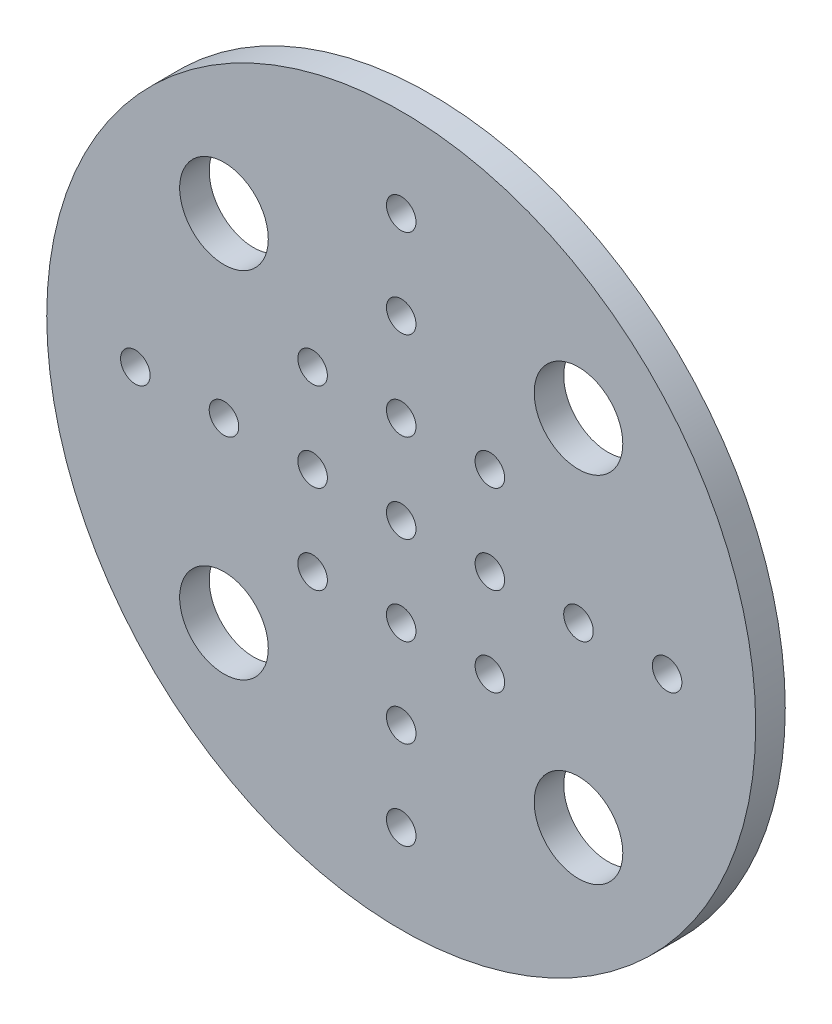
ISO-10303-21;
HEADER;
FILE_DESCRIPTION(('STEP AP214'),'2;1');
FILE_NAME('part.step','',(''),(''),'','','');
FILE_SCHEMA(('AUTOMOTIVE_DESIGN { 1 0 10303 214 1 1 1 1 }'));
ENDSEC;
DATA;
#1=APPLICATION_CONTEXT('core data for automotive mechanical design processes');
#2=APPLICATION_PROTOCOL_DEFINITION('international standard','automotive_design',2000,#1);
#3=PRODUCT_CONTEXT('',#1,'mechanical');
#4=PRODUCT('Part','Part','',(#3));
#5=PRODUCT_RELATED_PRODUCT_CATEGORY('part','',(#4));
#6=PRODUCT_DEFINITION_FORMATION('','',#4);
#7=PRODUCT_DEFINITION_CONTEXT('part definition',#1,'design');
#8=PRODUCT_DEFINITION('design','',#6,#7);
#9=PRODUCT_DEFINITION_SHAPE('','',#8);
#10=(LENGTH_UNIT() NAMED_UNIT(*) SI_UNIT(.MILLI.,.METRE.));
#11=(NAMED_UNIT(*) PLANE_ANGLE_UNIT() SI_UNIT($,.RADIAN.));
#12=(NAMED_UNIT(*) SI_UNIT($,.STERADIAN.) SOLID_ANGLE_UNIT());
#13=UNCERTAINTY_MEASURE_WITH_UNIT(LENGTH_MEASURE(1.E-05),#10,'distance_accuracy_value','');
#14=(GEOMETRIC_REPRESENTATION_CONTEXT(3) GLOBAL_UNCERTAINTY_ASSIGNED_CONTEXT((#13)) GLOBAL_UNIT_ASSIGNED_CONTEXT((#10,
#11,#12)) REPRESENTATION_CONTEXT('',''));
#15=CARTESIAN_POINT('',(0.,0.,0.));
#16=DIRECTION('',(0.,0.,1.));
#17=DIRECTION('',(1.,0.,0.));
#18=AXIS2_PLACEMENT_3D('',#15,#16,#17);
#19=CARTESIAN_POINT('',(225.2594539797,284.786767066,3.));
#20=DIRECTION('',(0.,0.,1.));
#21=DIRECTION('',(1.,0.,0.));
#22=AXIS2_PLACEMENT_3D('',#19,#20,#21);
#23=PLANE('',#22);
#24=CARTESIAN_POINT('',(234.2594539797,275.786767066,3.));
#25=DIRECTION('',(0.,0.,1.));
#26=DIRECTION('',(1.,0.,0.));
#27=AXIS2_PLACEMENT_3D('',#24,#25,#26);
#28=CIRCLE('',#27,1.5);
#29=CARTESIAN_POINT('',(235.7594539797,275.786767066,3.));
#30=VERTEX_POINT('',#29);
#31=EDGE_CURVE('E155',#30,#30,#28,.T.);
#32=ORIENTED_EDGE('',*,*,#31,.F.);
#33=EDGE_LOOP('',(#32));
#34=FACE_BOUND('',#33,.T.);
#35=CARTESIAN_POINT('',(216.2594539797,275.786767066,3.));
#36=DIRECTION('',(0.,0.,1.));
#37=DIRECTION('',(1.,0.,0.));
#38=AXIS2_PLACEMENT_3D('',#35,#36,#37);
#39=CIRCLE('',#38,1.5);
#40=CARTESIAN_POINT('',(217.7594539797,275.786767066,3.));
#41=VERTEX_POINT('',#40);
#42=EDGE_CURVE('E143',#41,#41,#39,.T.);
#43=ORIENTED_EDGE('',*,*,#42,.F.);
#44=EDGE_LOOP('',(#43));
#45=FACE_BOUND('',#44,.T.);
#46=CARTESIAN_POINT('',(225.2594539797,266.786767066,3.));
#47=DIRECTION('',(0.,0.,1.));
#48=DIRECTION('',(1.,0.,0.));
#49=AXIS2_PLACEMENT_3D('',#46,#47,#48);
#50=CIRCLE('',#49,1.5);
#51=CARTESIAN_POINT('',(226.7594539797,266.786767066,3.));
#52=VERTEX_POINT('',#51);
#53=EDGE_CURVE('E131',#52,#52,#50,.T.);
#54=ORIENTED_EDGE('',*,*,#53,.F.);
#55=EDGE_LOOP('',(#54));
#56=FACE_BOUND('',#55,.T.);
#57=CARTESIAN_POINT('',(225.2594539797,302.786767066,3.));
#58=DIRECTION('',(0.,0.,1.));
#59=DIRECTION('',(1.,0.,0.));
#60=AXIS2_PLACEMENT_3D('',#57,#58,#59);
#61=CIRCLE('',#60,1.5);
#62=CARTESIAN_POINT('',(226.7594539797,302.786767066,3.));
#63=VERTEX_POINT('',#62);
#64=EDGE_CURVE('E119',#63,#63,#61,.T.);
#65=ORIENTED_EDGE('',*,*,#64,.F.);
#66=EDGE_LOOP('',(#65));
#67=FACE_BOUND('',#66,.T.);
#68=CARTESIAN_POINT('',(198.2594539797,284.786767066,3.));
#69=DIRECTION('',(0.,0.,1.));
#70=DIRECTION('',(1.,0.,0.));
#71=AXIS2_PLACEMENT_3D('',#68,#69,#70);
#72=CIRCLE('',#71,1.5);
#73=CARTESIAN_POINT('',(199.7594539797,284.786767066,3.));
#74=VERTEX_POINT('',#73);
#75=EDGE_CURVE('E107',#74,#74,#72,.T.);
#76=ORIENTED_EDGE('',*,*,#75,.F.);
#77=EDGE_LOOP('',(#76));
#78=FACE_BOUND('',#77,.T.);
#79=CARTESIAN_POINT('',(243.2594539797,284.786767066,3.));
#80=DIRECTION('',(0.,0.,1.));
#81=DIRECTION('',(1.,0.,0.));
#82=AXIS2_PLACEMENT_3D('',#79,#80,#81);
#83=CIRCLE('',#82,1.5);
#84=CARTESIAN_POINT('',(244.7594539797,284.786767066,3.));
#85=VERTEX_POINT('',#84);
#86=EDGE_CURVE('E95',#85,#85,#83,.T.);
#87=ORIENTED_EDGE('',*,*,#86,.F.);
#88=EDGE_LOOP('',(#87));
#89=FACE_BOUND('',#88,.T.);
#90=CARTESIAN_POINT('',(234.2594539797,284.786767066,3.));
#91=DIRECTION('',(0.,0.,1.));
#92=DIRECTION('',(1.,0.,0.));
#93=AXIS2_PLACEMENT_3D('',#90,#91,#92);
#94=CIRCLE('',#93,1.5);
#95=CARTESIAN_POINT('',(235.7594539797,284.786767066,3.));
#96=VERTEX_POINT('',#95);
#97=EDGE_CURVE('E83',#96,#96,#94,.T.);
#98=ORIENTED_EDGE('',*,*,#97,.F.);
#99=EDGE_LOOP('',(#98));
#100=FACE_BOUND('',#99,.T.);
#101=CARTESIAN_POINT('',(225.2594539797,275.786767066,3.));
#102=DIRECTION('',(0.,0.,1.));
#103=DIRECTION('',(1.,0.,0.));
#104=AXIS2_PLACEMENT_3D('',#101,#102,#103);
#105=CIRCLE('',#104,1.5);
#106=CARTESIAN_POINT('',(226.7594539797,275.786767066,3.));
#107=VERTEX_POINT('',#106);
#108=EDGE_CURVE('E71',#107,#107,#105,.T.);
#109=ORIENTED_EDGE('',*,*,#108,.F.);
#110=EDGE_LOOP('',(#109));
#111=FACE_BOUND('',#110,.T.);
#112=CARTESIAN_POINT('',(243.2594539797,302.786767066,3.));
#113=DIRECTION('',(0.,0.,1.));
#114=DIRECTION('',(1.,0.,0.));
#115=AXIS2_PLACEMENT_3D('',#112,#113,#114);
#116=CIRCLE('',#115,4.5);
#117=CARTESIAN_POINT('',(247.7594539797,302.786767066,3.));
#118=VERTEX_POINT('',#117);
#119=EDGE_CURVE('E59',#118,#118,#116,.T.);
#120=ORIENTED_EDGE('',*,*,#119,.F.);
#121=EDGE_LOOP('',(#120));
#122=FACE_BOUND('',#121,.T.);
#123=CARTESIAN_POINT('',(207.2594539797,266.786767066,3.));
#124=DIRECTION('',(0.,0.,1.));
#125=DIRECTION('',(1.,0.,0.));
#126=AXIS2_PLACEMENT_3D('',#123,#124,#125);
#127=CIRCLE('',#126,4.5);
#128=CARTESIAN_POINT('',(211.7594539797,266.786767066,3.));
#129=VERTEX_POINT('',#128);
#130=EDGE_CURVE('E47',#129,#129,#127,.T.);
#131=ORIENTED_EDGE('',*,*,#130,.F.);
#132=EDGE_LOOP('',(#131));
#133=FACE_BOUND('',#132,.T.);
#134=CARTESIAN_POINT('',(225.2594539797,284.786767066,3.));
#135=DIRECTION('',(0.,0.,1.));
#136=DIRECTION('',(1.,0.,0.));
#137=AXIS2_PLACEMENT_3D('',#134,#135,#136);
#138=CIRCLE('',#137,36.);
#139=CARTESIAN_POINT('',(261.2594539797,284.786767066,3.));
#140=VERTEX_POINT('',#139);
#141=EDGE_CURVE('E10',#140,#140,#138,.T.);
#142=ORIENTED_EDGE('',*,*,#141,.T.);
#143=EDGE_LOOP('',(#142));
#144=FACE_BOUND('',#143,.T.);
#145=CARTESIAN_POINT('',(207.2594539797,302.786767066,3.));
#146=DIRECTION('',(0.,0.,1.));
#147=DIRECTION('',(1.,0.,0.));
#148=AXIS2_PLACEMENT_3D('',#145,#146,#147);
#149=CIRCLE('',#148,4.5);
#150=CARTESIAN_POINT('',(211.7594539797,302.786767066,3.));
#151=VERTEX_POINT('',#150);
#152=EDGE_CURVE('E42',#151,#151,#149,.T.);
#153=ORIENTED_EDGE('',*,*,#152,.F.);
#154=EDGE_LOOP('',(#153));
#155=FACE_BOUND('',#154,.T.);
#156=CARTESIAN_POINT('',(243.2594539797,266.786767066,3.));
#157=DIRECTION('',(0.,0.,1.));
#158=DIRECTION('',(1.,0.,0.));
#159=AXIS2_PLACEMENT_3D('',#156,#157,#158);
#160=CIRCLE('',#159,4.5);
#161=CARTESIAN_POINT('',(247.7594539797,266.786767066,3.));
#162=VERTEX_POINT('',#161);
#163=EDGE_CURVE('E53',#162,#162,#160,.T.);
#164=ORIENTED_EDGE('',*,*,#163,.F.);
#165=EDGE_LOOP('',(#164));
#166=FACE_BOUND('',#165,.T.);
#167=CARTESIAN_POINT('',(225.2594539797,284.786767066,3.));
#168=DIRECTION('',(0.,0.,1.));
#169=DIRECTION('',(1.,0.,0.));
#170=AXIS2_PLACEMENT_3D('',#167,#168,#169);
#171=CIRCLE('',#170,1.5);
#172=CARTESIAN_POINT('',(226.7594539797,284.786767066,3.));
#173=VERTEX_POINT('',#172);
#174=EDGE_CURVE('E65',#173,#173,#171,.T.);
#175=ORIENTED_EDGE('',*,*,#174,.F.);
#176=EDGE_LOOP('',(#175));
#177=FACE_BOUND('',#176,.T.);
#178=CARTESIAN_POINT('',(225.2594539797,293.786767066,3.));
#179=DIRECTION('',(0.,0.,1.));
#180=DIRECTION('',(1.,0.,0.));
#181=AXIS2_PLACEMENT_3D('',#178,#179,#180);
#182=CIRCLE('',#181,1.5);
#183=CARTESIAN_POINT('',(226.7594539797,293.786767066,3.));
#184=VERTEX_POINT('',#183);
#185=EDGE_CURVE('E77',#184,#184,#182,.T.);
#186=ORIENTED_EDGE('',*,*,#185,.F.);
#187=EDGE_LOOP('',(#186));
#188=FACE_BOUND('',#187,.T.);
#189=CARTESIAN_POINT('',(216.2594539797,284.786767066,3.));
#190=DIRECTION('',(0.,0.,1.));
#191=DIRECTION('',(1.,0.,0.));
#192=AXIS2_PLACEMENT_3D('',#189,#190,#191);
#193=CIRCLE('',#192,1.5);
#194=CARTESIAN_POINT('',(217.7594539797,284.786767066,3.));
#195=VERTEX_POINT('',#194);
#196=EDGE_CURVE('E89',#195,#195,#193,.T.);
#197=ORIENTED_EDGE('',*,*,#196,.F.);
#198=EDGE_LOOP('',(#197));
#199=FACE_BOUND('',#198,.T.);
#200=CARTESIAN_POINT('',(252.2594539797,284.786767066,3.));
#201=DIRECTION('',(0.,0.,1.));
#202=DIRECTION('',(1.,0.,0.));
#203=AXIS2_PLACEMENT_3D('',#200,#201,#202);
#204=CIRCLE('',#203,1.5);
#205=CARTESIAN_POINT('',(253.7594539797,284.786767066,3.));
#206=VERTEX_POINT('',#205);
#207=EDGE_CURVE('E101',#206,#206,#204,.T.);
#208=ORIENTED_EDGE('',*,*,#207,.F.);
#209=EDGE_LOOP('',(#208));
#210=FACE_BOUND('',#209,.T.);
#211=CARTESIAN_POINT('',(207.2594539797,284.786767066,3.));
#212=DIRECTION('',(0.,0.,1.));
#213=DIRECTION('',(1.,0.,0.));
#214=AXIS2_PLACEMENT_3D('',#211,#212,#213);
#215=CIRCLE('',#214,1.5);
#216=CARTESIAN_POINT('',(208.7594539797,284.786767066,3.));
#217=VERTEX_POINT('',#216);
#218=EDGE_CURVE('E113',#217,#217,#215,.T.);
#219=ORIENTED_EDGE('',*,*,#218,.F.);
#220=EDGE_LOOP('',(#219));
#221=FACE_BOUND('',#220,.T.);
#222=CARTESIAN_POINT('',(225.2594539797,311.786767066,3.));
#223=DIRECTION('',(0.,0.,1.));
#224=DIRECTION('',(1.,0.,0.));
#225=AXIS2_PLACEMENT_3D('',#222,#223,#224);
#226=CIRCLE('',#225,1.5);
#227=CARTESIAN_POINT('',(226.7594539797,311.786767066,3.));
#228=VERTEX_POINT('',#227);
#229=EDGE_CURVE('E125',#228,#228,#226,.T.);
#230=ORIENTED_EDGE('',*,*,#229,.F.);
#231=EDGE_LOOP('',(#230));
#232=FACE_BOUND('',#231,.T.);
#233=CARTESIAN_POINT('',(225.2594539797,257.786767066,3.));
#234=DIRECTION('',(0.,0.,1.));
#235=DIRECTION('',(1.,0.,0.));
#236=AXIS2_PLACEMENT_3D('',#233,#234,#235);
#237=CIRCLE('',#236,1.5);
#238=CARTESIAN_POINT('',(226.7594539797,257.786767066,3.));
#239=VERTEX_POINT('',#238);
#240=EDGE_CURVE('E137',#239,#239,#237,.T.);
#241=ORIENTED_EDGE('',*,*,#240,.F.);
#242=EDGE_LOOP('',(#241));
#243=FACE_BOUND('',#242,.T.);
#244=CARTESIAN_POINT('',(234.2594539797,293.786767066,3.));
#245=DIRECTION('',(0.,0.,1.));
#246=DIRECTION('',(1.,0.,0.));
#247=AXIS2_PLACEMENT_3D('',#244,#245,#246);
#248=CIRCLE('',#247,1.5);
#249=CARTESIAN_POINT('',(235.7594539797,293.786767066,3.));
#250=VERTEX_POINT('',#249);
#251=EDGE_CURVE('E149',#250,#250,#248,.T.);
#252=ORIENTED_EDGE('',*,*,#251,.F.);
#253=EDGE_LOOP('',(#252));
#254=FACE_BOUND('',#253,.T.);
#255=CARTESIAN_POINT('',(216.2594539797,293.786767066,3.));
#256=DIRECTION('',(0.,0.,1.));
#257=DIRECTION('',(1.,0.,0.));
#258=AXIS2_PLACEMENT_3D('',#255,#256,#257);
#259=CIRCLE('',#258,1.5);
#260=CARTESIAN_POINT('',(217.7594539797,293.786767066,3.));
#261=VERTEX_POINT('',#260);
#262=EDGE_CURVE('E161',#261,#261,#259,.T.);
#263=ORIENTED_EDGE('',*,*,#262,.F.);
#264=EDGE_LOOP('',(#263));
#265=FACE_BOUND('',#264,.T.);
#266=ADVANCED_FACE('F31',(#34,#45,#56,#67,#78,#89,#100,#111,#122,#133,#144,#155,#166,#177,#188,
#199,#210,#221,#232,#243,#254,#265),#23,.T.);
#267=CARTESIAN_POINT('',(225.2594539797,284.786767066,0.));
#268=DIRECTION('',(0.,0.,1.));
#269=DIRECTION('',(1.,0.,0.));
#270=AXIS2_PLACEMENT_3D('',#267,#268,#269);
#271=PLANE('',#270);
#272=CARTESIAN_POINT('',(234.2594539797,275.786767066,0.));
#273=DIRECTION('',(0.,0.,1.));
#274=DIRECTION('',(1.,0.,0.));
#275=AXIS2_PLACEMENT_3D('',#272,#273,#274);
#276=CIRCLE('',#275,1.5);
#277=CARTESIAN_POINT('',(235.7594539797,275.786767066,0.));
#278=VERTEX_POINT('',#277);
#279=EDGE_CURVE('E158',#278,#278,#276,.T.);
#280=ORIENTED_EDGE('',*,*,#279,.T.);
#281=EDGE_LOOP('',(#280));
#282=FACE_BOUND('',#281,.T.);
#283=CARTESIAN_POINT('',(216.2594539797,275.786767066,0.));
#284=DIRECTION('',(0.,0.,1.));
#285=DIRECTION('',(1.,0.,0.));
#286=AXIS2_PLACEMENT_3D('',#283,#284,#285);
#287=CIRCLE('',#286,1.5);
#288=CARTESIAN_POINT('',(217.7594539797,275.786767066,0.));
#289=VERTEX_POINT('',#288);
#290=EDGE_CURVE('E146',#289,#289,#287,.T.);
#291=ORIENTED_EDGE('',*,*,#290,.T.);
#292=EDGE_LOOP('',(#291));
#293=FACE_BOUND('',#292,.T.);
#294=CARTESIAN_POINT('',(225.2594539797,266.786767066,0.));
#295=DIRECTION('',(0.,0.,1.));
#296=DIRECTION('',(1.,0.,0.));
#297=AXIS2_PLACEMENT_3D('',#294,#295,#296);
#298=CIRCLE('',#297,1.5);
#299=CARTESIAN_POINT('',(226.7594539797,266.786767066,0.));
#300=VERTEX_POINT('',#299);
#301=EDGE_CURVE('E134',#300,#300,#298,.T.);
#302=ORIENTED_EDGE('',*,*,#301,.T.);
#303=EDGE_LOOP('',(#302));
#304=FACE_BOUND('',#303,.T.);
#305=CARTESIAN_POINT('',(225.2594539797,302.786767066,0.));
#306=DIRECTION('',(0.,0.,1.));
#307=DIRECTION('',(1.,0.,0.));
#308=AXIS2_PLACEMENT_3D('',#305,#306,#307);
#309=CIRCLE('',#308,1.5);
#310=CARTESIAN_POINT('',(226.7594539797,302.786767066,0.));
#311=VERTEX_POINT('',#310);
#312=EDGE_CURVE('E122',#311,#311,#309,.T.);
#313=ORIENTED_EDGE('',*,*,#312,.T.);
#314=EDGE_LOOP('',(#313));
#315=FACE_BOUND('',#314,.T.);
#316=CARTESIAN_POINT('',(198.2594539797,284.786767066,0.));
#317=DIRECTION('',(0.,0.,1.));
#318=DIRECTION('',(1.,0.,0.));
#319=AXIS2_PLACEMENT_3D('',#316,#317,#318);
#320=CIRCLE('',#319,1.5);
#321=CARTESIAN_POINT('',(199.7594539797,284.786767066,0.));
#322=VERTEX_POINT('',#321);
#323=EDGE_CURVE('E110',#322,#322,#320,.T.);
#324=ORIENTED_EDGE('',*,*,#323,.T.);
#325=EDGE_LOOP('',(#324));
#326=FACE_BOUND('',#325,.T.);
#327=CARTESIAN_POINT('',(243.2594539797,284.786767066,0.));
#328=DIRECTION('',(0.,0.,1.));
#329=DIRECTION('',(1.,0.,0.));
#330=AXIS2_PLACEMENT_3D('',#327,#328,#329);
#331=CIRCLE('',#330,1.5);
#332=CARTESIAN_POINT('',(244.7594539797,284.786767066,0.));
#333=VERTEX_POINT('',#332);
#334=EDGE_CURVE('E98',#333,#333,#331,.T.);
#335=ORIENTED_EDGE('',*,*,#334,.T.);
#336=EDGE_LOOP('',(#335));
#337=FACE_BOUND('',#336,.T.);
#338=CARTESIAN_POINT('',(234.2594539797,284.786767066,0.));
#339=DIRECTION('',(0.,0.,1.));
#340=DIRECTION('',(1.,0.,0.));
#341=AXIS2_PLACEMENT_3D('',#338,#339,#340);
#342=CIRCLE('',#341,1.5);
#343=CARTESIAN_POINT('',(235.7594539797,284.786767066,0.));
#344=VERTEX_POINT('',#343);
#345=EDGE_CURVE('E86',#344,#344,#342,.T.);
#346=ORIENTED_EDGE('',*,*,#345,.T.);
#347=EDGE_LOOP('',(#346));
#348=FACE_BOUND('',#347,.T.);
#349=CARTESIAN_POINT('',(225.2594539797,275.786767066,0.));
#350=DIRECTION('',(0.,0.,1.));
#351=DIRECTION('',(1.,0.,0.));
#352=AXIS2_PLACEMENT_3D('',#349,#350,#351);
#353=CIRCLE('',#352,1.5);
#354=CARTESIAN_POINT('',(226.7594539797,275.786767066,0.));
#355=VERTEX_POINT('',#354);
#356=EDGE_CURVE('E74',#355,#355,#353,.T.);
#357=ORIENTED_EDGE('',*,*,#356,.T.);
#358=EDGE_LOOP('',(#357));
#359=FACE_BOUND('',#358,.T.);
#360=CARTESIAN_POINT('',(243.2594539797,302.786767066,0.));
#361=DIRECTION('',(0.,0.,1.));
#362=DIRECTION('',(1.,0.,0.));
#363=AXIS2_PLACEMENT_3D('',#360,#361,#362);
#364=CIRCLE('',#363,4.5);
#365=CARTESIAN_POINT('',(247.7594539797,302.786767066,0.));
#366=VERTEX_POINT('',#365);
#367=EDGE_CURVE('E62',#366,#366,#364,.T.);
#368=ORIENTED_EDGE('',*,*,#367,.T.);
#369=EDGE_LOOP('',(#368));
#370=FACE_BOUND('',#369,.T.);
#371=CARTESIAN_POINT('',(207.2594539797,266.786767066,0.));
#372=DIRECTION('',(0.,0.,1.));
#373=DIRECTION('',(1.,0.,0.));
#374=AXIS2_PLACEMENT_3D('',#371,#372,#373);
#375=CIRCLE('',#374,4.5);
#376=CARTESIAN_POINT('',(211.7594539797,266.786767066,0.));
#377=VERTEX_POINT('',#376);
#378=EDGE_CURVE('E50',#377,#377,#375,.T.);
#379=ORIENTED_EDGE('',*,*,#378,.T.);
#380=EDGE_LOOP('',(#379));
#381=FACE_BOUND('',#380,.T.);
#382=CARTESIAN_POINT('',(225.2594539797,284.786767066,0.));
#383=DIRECTION('',(0.,0.,1.));
#384=DIRECTION('',(1.,0.,0.));
#385=AXIS2_PLACEMENT_3D('',#382,#383,#384);
#386=CIRCLE('',#385,36.);
#387=CARTESIAN_POINT('',(261.2594539797,284.786767066,0.));
#388=VERTEX_POINT('',#387);
#389=EDGE_CURVE('E35',#388,#388,#386,.T.);
#390=ORIENTED_EDGE('',*,*,#389,.F.);
#391=EDGE_LOOP('',(#390));
#392=FACE_BOUND('',#391,.T.);
#393=CARTESIAN_POINT('',(207.2594539797,302.786767066,0.));
#394=DIRECTION('',(0.,0.,1.));
#395=DIRECTION('',(1.,0.,0.));
#396=AXIS2_PLACEMENT_3D('',#393,#394,#395);
#397=CIRCLE('',#396,4.5);
#398=CARTESIAN_POINT('',(211.7594539797,302.786767066,0.));
#399=VERTEX_POINT('',#398);
#400=EDGE_CURVE('E44',#399,#399,#397,.T.);
#401=ORIENTED_EDGE('',*,*,#400,.T.);
#402=EDGE_LOOP('',(#401));
#403=FACE_BOUND('',#402,.T.);
#404=CARTESIAN_POINT('',(243.2594539797,266.786767066,0.));
#405=DIRECTION('',(0.,0.,1.));
#406=DIRECTION('',(1.,0.,0.));
#407=AXIS2_PLACEMENT_3D('',#404,#405,#406);
#408=CIRCLE('',#407,4.5);
#409=CARTESIAN_POINT('',(247.7594539797,266.786767066,0.));
#410=VERTEX_POINT('',#409);
#411=EDGE_CURVE('E56',#410,#410,#408,.T.);
#412=ORIENTED_EDGE('',*,*,#411,.T.);
#413=EDGE_LOOP('',(#412));
#414=FACE_BOUND('',#413,.T.);
#415=CARTESIAN_POINT('',(225.2594539797,284.786767066,0.));
#416=DIRECTION('',(0.,0.,1.));
#417=DIRECTION('',(1.,0.,0.));
#418=AXIS2_PLACEMENT_3D('',#415,#416,#417);
#419=CIRCLE('',#418,1.5);
#420=CARTESIAN_POINT('',(226.7594539797,284.786767066,0.));
#421=VERTEX_POINT('',#420);
#422=EDGE_CURVE('E68',#421,#421,#419,.T.);
#423=ORIENTED_EDGE('',*,*,#422,.T.);
#424=EDGE_LOOP('',(#423));
#425=FACE_BOUND('',#424,.T.);
#426=CARTESIAN_POINT('',(225.2594539797,293.786767066,0.));
#427=DIRECTION('',(0.,0.,1.));
#428=DIRECTION('',(1.,0.,0.));
#429=AXIS2_PLACEMENT_3D('',#426,#427,#428);
#430=CIRCLE('',#429,1.5);
#431=CARTESIAN_POINT('',(226.7594539797,293.786767066,0.));
#432=VERTEX_POINT('',#431);
#433=EDGE_CURVE('E80',#432,#432,#430,.T.);
#434=ORIENTED_EDGE('',*,*,#433,.T.);
#435=EDGE_LOOP('',(#434));
#436=FACE_BOUND('',#435,.T.);
#437=CARTESIAN_POINT('',(216.2594539797,284.786767066,0.));
#438=DIRECTION('',(0.,0.,1.));
#439=DIRECTION('',(1.,0.,0.));
#440=AXIS2_PLACEMENT_3D('',#437,#438,#439);
#441=CIRCLE('',#440,1.5);
#442=CARTESIAN_POINT('',(217.7594539797,284.786767066,0.));
#443=VERTEX_POINT('',#442);
#444=EDGE_CURVE('E92',#443,#443,#441,.T.);
#445=ORIENTED_EDGE('',*,*,#444,.T.);
#446=EDGE_LOOP('',(#445));
#447=FACE_BOUND('',#446,.T.);
#448=CARTESIAN_POINT('',(252.2594539797,284.786767066,0.));
#449=DIRECTION('',(0.,0.,1.));
#450=DIRECTION('',(1.,0.,0.));
#451=AXIS2_PLACEMENT_3D('',#448,#449,#450);
#452=CIRCLE('',#451,1.5);
#453=CARTESIAN_POINT('',(253.7594539797,284.786767066,0.));
#454=VERTEX_POINT('',#453);
#455=EDGE_CURVE('E104',#454,#454,#452,.T.);
#456=ORIENTED_EDGE('',*,*,#455,.T.);
#457=EDGE_LOOP('',(#456));
#458=FACE_BOUND('',#457,.T.);
#459=CARTESIAN_POINT('',(207.2594539797,284.786767066,0.));
#460=DIRECTION('',(0.,0.,1.));
#461=DIRECTION('',(1.,0.,0.));
#462=AXIS2_PLACEMENT_3D('',#459,#460,#461);
#463=CIRCLE('',#462,1.5);
#464=CARTESIAN_POINT('',(208.7594539797,284.786767066,0.));
#465=VERTEX_POINT('',#464);
#466=EDGE_CURVE('E116',#465,#465,#463,.T.);
#467=ORIENTED_EDGE('',*,*,#466,.T.);
#468=EDGE_LOOP('',(#467));
#469=FACE_BOUND('',#468,.T.);
#470=CARTESIAN_POINT('',(225.2594539797,311.786767066,0.));
#471=DIRECTION('',(0.,0.,1.));
#472=DIRECTION('',(1.,0.,0.));
#473=AXIS2_PLACEMENT_3D('',#470,#471,#472);
#474=CIRCLE('',#473,1.5);
#475=CARTESIAN_POINT('',(226.7594539797,311.786767066,0.));
#476=VERTEX_POINT('',#475);
#477=EDGE_CURVE('E128',#476,#476,#474,.T.);
#478=ORIENTED_EDGE('',*,*,#477,.T.);
#479=EDGE_LOOP('',(#478));
#480=FACE_BOUND('',#479,.T.);
#481=CARTESIAN_POINT('',(225.2594539797,257.786767066,0.));
#482=DIRECTION('',(0.,0.,1.));
#483=DIRECTION('',(1.,0.,0.));
#484=AXIS2_PLACEMENT_3D('',#481,#482,#483);
#485=CIRCLE('',#484,1.5);
#486=CARTESIAN_POINT('',(226.7594539797,257.786767066,0.));
#487=VERTEX_POINT('',#486);
#488=EDGE_CURVE('E140',#487,#487,#485,.T.);
#489=ORIENTED_EDGE('',*,*,#488,.T.);
#490=EDGE_LOOP('',(#489));
#491=FACE_BOUND('',#490,.T.);
#492=CARTESIAN_POINT('',(234.2594539797,293.786767066,0.));
#493=DIRECTION('',(0.,0.,1.));
#494=DIRECTION('',(1.,0.,0.));
#495=AXIS2_PLACEMENT_3D('',#492,#493,#494);
#496=CIRCLE('',#495,1.5);
#497=CARTESIAN_POINT('',(235.7594539797,293.786767066,0.));
#498=VERTEX_POINT('',#497);
#499=EDGE_CURVE('E152',#498,#498,#496,.T.);
#500=ORIENTED_EDGE('',*,*,#499,.T.);
#501=EDGE_LOOP('',(#500));
#502=FACE_BOUND('',#501,.T.);
#503=CARTESIAN_POINT('',(216.2594539797,293.786767066,0.));
#504=DIRECTION('',(0.,0.,1.));
#505=DIRECTION('',(1.,0.,0.));
#506=AXIS2_PLACEMENT_3D('',#503,#504,#505);
#507=CIRCLE('',#506,1.5);
#508=CARTESIAN_POINT('',(217.7594539797,293.786767066,0.));
#509=VERTEX_POINT('',#508);
#510=EDGE_CURVE('E164',#509,#509,#507,.T.);
#511=ORIENTED_EDGE('',*,*,#510,.T.);
#512=EDGE_LOOP('',(#511));
#513=FACE_BOUND('',#512,.T.);
#514=ADVANCED_FACE('F174',(#282,#293,#304,#315,#326,#337,#348,#359,#370,#381,#392,#403,#414,
#425,#436,#447,#458,#469,#480,#491,#502,#513),#271,.F.);
#515=CARTESIAN_POINT('',(225.2594539797,284.786767066,3.));
#516=DIRECTION('',(0.,0.,-1.));
#517=DIRECTION('',(-1.,0.,0.));
#518=AXIS2_PLACEMENT_3D('',#515,#516,#517);
#519=CYLINDRICAL_SURFACE('',#518,36.);
#520=ORIENTED_EDGE('',*,*,#141,.F.);
#521=EDGE_LOOP('',(#520));
#522=FACE_BOUND('',#521,.T.);
#523=ORIENTED_EDGE('',*,*,#389,.T.);
#524=EDGE_LOOP('',(#523));
#525=FACE_BOUND('',#524,.T.);
#526=ADVANCED_FACE('F33',(#522,#525),#519,.T.);
#527=CARTESIAN_POINT('',(207.2594539797,302.786767066,3.));
#528=DIRECTION('',(0.,0.,-1.));
#529=DIRECTION('',(-1.,0.,0.));
#530=AXIS2_PLACEMENT_3D('',#527,#528,#529);
#531=CYLINDRICAL_SURFACE('',#530,4.5);
#532=ORIENTED_EDGE('',*,*,#152,.T.);
#533=EDGE_LOOP('',(#532));
#534=FACE_BOUND('',#533,.T.);
#535=ORIENTED_EDGE('',*,*,#400,.F.);
#536=EDGE_LOOP('',(#535));
#537=FACE_BOUND('',#536,.T.);
#538=ADVANCED_FACE('F184',(#534,#537),#531,.F.);
#539=CARTESIAN_POINT('',(207.2594539797,266.786767066,3.));
#540=DIRECTION('',(0.,0.,-1.));
#541=DIRECTION('',(-1.,0.,0.));
#542=AXIS2_PLACEMENT_3D('',#539,#540,#541);
#543=CYLINDRICAL_SURFACE('',#542,4.5);
#544=ORIENTED_EDGE('',*,*,#130,.T.);
#545=EDGE_LOOP('',(#544));
#546=FACE_BOUND('',#545,.T.);
#547=ORIENTED_EDGE('',*,*,#378,.F.);
#548=EDGE_LOOP('',(#547));
#549=FACE_BOUND('',#548,.T.);
#550=ADVANCED_FACE('F187',(#546,#549),#543,.F.);
#551=CARTESIAN_POINT('',(243.2594539797,266.786767066,3.));
#552=DIRECTION('',(0.,0.,-1.));
#553=DIRECTION('',(-1.,0.,0.));
#554=AXIS2_PLACEMENT_3D('',#551,#552,#553);
#555=CYLINDRICAL_SURFACE('',#554,4.5);
#556=ORIENTED_EDGE('',*,*,#163,.T.);
#557=EDGE_LOOP('',(#556));
#558=FACE_BOUND('',#557,.T.);
#559=ORIENTED_EDGE('',*,*,#411,.F.);
#560=EDGE_LOOP('',(#559));
#561=FACE_BOUND('',#560,.T.);
#562=ADVANCED_FACE('F191',(#558,#561),#555,.F.);
#563=CARTESIAN_POINT('',(243.2594539797,302.786767066,3.));
#564=DIRECTION('',(0.,0.,-1.));
#565=DIRECTION('',(-1.,0.,0.));
#566=AXIS2_PLACEMENT_3D('',#563,#564,#565);
#567=CYLINDRICAL_SURFACE('',#566,4.5);
#568=ORIENTED_EDGE('',*,*,#119,.T.);
#569=EDGE_LOOP('',(#568));
#570=FACE_BOUND('',#569,.T.);
#571=ORIENTED_EDGE('',*,*,#367,.F.);
#572=EDGE_LOOP('',(#571));
#573=FACE_BOUND('',#572,.T.);
#574=ADVANCED_FACE('F195',(#570,#573),#567,.F.);
#575=CARTESIAN_POINT('',(225.2594539797,284.786767066,3.));
#576=DIRECTION('',(0.,0.,-1.));
#577=DIRECTION('',(-1.,0.,0.));
#578=AXIS2_PLACEMENT_3D('',#575,#576,#577);
#579=CYLINDRICAL_SURFACE('',#578,1.5);
#580=ORIENTED_EDGE('',*,*,#174,.T.);
#581=EDGE_LOOP('',(#580));
#582=FACE_BOUND('',#581,.T.);
#583=ORIENTED_EDGE('',*,*,#422,.F.);
#584=EDGE_LOOP('',(#583));
#585=FACE_BOUND('',#584,.T.);
#586=ADVANCED_FACE('F199',(#582,#585),#579,.F.);
#587=CARTESIAN_POINT('',(225.2594539797,275.786767066,3.));
#588=DIRECTION('',(0.,0.,-1.));
#589=DIRECTION('',(-1.,0.,0.));
#590=AXIS2_PLACEMENT_3D('',#587,#588,#589);
#591=CYLINDRICAL_SURFACE('',#590,1.5);
#592=ORIENTED_EDGE('',*,*,#108,.T.);
#593=EDGE_LOOP('',(#592));
#594=FACE_BOUND('',#593,.T.);
#595=ORIENTED_EDGE('',*,*,#356,.F.);
#596=EDGE_LOOP('',(#595));
#597=FACE_BOUND('',#596,.T.);
#598=ADVANCED_FACE('F203',(#594,#597),#591,.F.);
#599=CARTESIAN_POINT('',(225.2594539797,293.786767066,3.));
#600=DIRECTION('',(0.,0.,-1.));
#601=DIRECTION('',(-1.,0.,0.));
#602=AXIS2_PLACEMENT_3D('',#599,#600,#601);
#603=CYLINDRICAL_SURFACE('',#602,1.5);
#604=ORIENTED_EDGE('',*,*,#185,.T.);
#605=EDGE_LOOP('',(#604));
#606=FACE_BOUND('',#605,.T.);
#607=ORIENTED_EDGE('',*,*,#433,.F.);
#608=EDGE_LOOP('',(#607));
#609=FACE_BOUND('',#608,.T.);
#610=ADVANCED_FACE('F207',(#606,#609),#603,.F.);
#611=CARTESIAN_POINT('',(234.2594539797,284.786767066,3.));
#612=DIRECTION('',(0.,0.,-1.));
#613=DIRECTION('',(-1.,0.,0.));
#614=AXIS2_PLACEMENT_3D('',#611,#612,#613);
#615=CYLINDRICAL_SURFACE('',#614,1.5);
#616=ORIENTED_EDGE('',*,*,#97,.T.);
#617=EDGE_LOOP('',(#616));
#618=FACE_BOUND('',#617,.T.);
#619=ORIENTED_EDGE('',*,*,#345,.F.);
#620=EDGE_LOOP('',(#619));
#621=FACE_BOUND('',#620,.T.);
#622=ADVANCED_FACE('F211',(#618,#621),#615,.F.);
#623=CARTESIAN_POINT('',(216.2594539797,284.786767066,3.));
#624=DIRECTION('',(0.,0.,-1.));
#625=DIRECTION('',(-1.,0.,0.));
#626=AXIS2_PLACEMENT_3D('',#623,#624,#625);
#627=CYLINDRICAL_SURFACE('',#626,1.5);
#628=ORIENTED_EDGE('',*,*,#196,.T.);
#629=EDGE_LOOP('',(#628));
#630=FACE_BOUND('',#629,.T.);
#631=ORIENTED_EDGE('',*,*,#444,.F.);
#632=EDGE_LOOP('',(#631));
#633=FACE_BOUND('',#632,.T.);
#634=ADVANCED_FACE('F215',(#630,#633),#627,.F.);
#635=CARTESIAN_POINT('',(243.2594539797,284.786767066,3.));
#636=DIRECTION('',(0.,0.,-1.));
#637=DIRECTION('',(-1.,0.,0.));
#638=AXIS2_PLACEMENT_3D('',#635,#636,#637);
#639=CYLINDRICAL_SURFACE('',#638,1.5);
#640=ORIENTED_EDGE('',*,*,#86,.T.);
#641=EDGE_LOOP('',(#640));
#642=FACE_BOUND('',#641,.T.);
#643=ORIENTED_EDGE('',*,*,#334,.F.);
#644=EDGE_LOOP('',(#643));
#645=FACE_BOUND('',#644,.T.);
#646=ADVANCED_FACE('F219',(#642,#645),#639,.F.);
#647=CARTESIAN_POINT('',(252.2594539797,284.786767066,3.));
#648=DIRECTION('',(0.,0.,-1.));
#649=DIRECTION('',(-1.,0.,0.));
#650=AXIS2_PLACEMENT_3D('',#647,#648,#649);
#651=CYLINDRICAL_SURFACE('',#650,1.5);
#652=ORIENTED_EDGE('',*,*,#207,.T.);
#653=EDGE_LOOP('',(#652));
#654=FACE_BOUND('',#653,.T.);
#655=ORIENTED_EDGE('',*,*,#455,.F.);
#656=EDGE_LOOP('',(#655));
#657=FACE_BOUND('',#656,.T.);
#658=ADVANCED_FACE('F223',(#654,#657),#651,.F.);
#659=CARTESIAN_POINT('',(198.2594539797,284.786767066,3.));
#660=DIRECTION('',(0.,0.,-1.));
#661=DIRECTION('',(-1.,0.,0.));
#662=AXIS2_PLACEMENT_3D('',#659,#660,#661);
#663=CYLINDRICAL_SURFACE('',#662,1.5);
#664=ORIENTED_EDGE('',*,*,#75,.T.);
#665=EDGE_LOOP('',(#664));
#666=FACE_BOUND('',#665,.T.);
#667=ORIENTED_EDGE('',*,*,#323,.F.);
#668=EDGE_LOOP('',(#667));
#669=FACE_BOUND('',#668,.T.);
#670=ADVANCED_FACE('F227',(#666,#669),#663,.F.);
#671=CARTESIAN_POINT('',(207.2594539797,284.786767066,3.));
#672=DIRECTION('',(0.,0.,-1.));
#673=DIRECTION('',(-1.,0.,0.));
#674=AXIS2_PLACEMENT_3D('',#671,#672,#673);
#675=CYLINDRICAL_SURFACE('',#674,1.5);
#676=ORIENTED_EDGE('',*,*,#218,.T.);
#677=EDGE_LOOP('',(#676));
#678=FACE_BOUND('',#677,.T.);
#679=ORIENTED_EDGE('',*,*,#466,.F.);
#680=EDGE_LOOP('',(#679));
#681=FACE_BOUND('',#680,.T.);
#682=ADVANCED_FACE('F231',(#678,#681),#675,.F.);
#683=CARTESIAN_POINT('',(225.2594539797,302.786767066,3.));
#684=DIRECTION('',(0.,0.,-1.));
#685=DIRECTION('',(-1.,0.,0.));
#686=AXIS2_PLACEMENT_3D('',#683,#684,#685);
#687=CYLINDRICAL_SURFACE('',#686,1.5);
#688=ORIENTED_EDGE('',*,*,#64,.T.);
#689=EDGE_LOOP('',(#688));
#690=FACE_BOUND('',#689,.T.);
#691=ORIENTED_EDGE('',*,*,#312,.F.);
#692=EDGE_LOOP('',(#691));
#693=FACE_BOUND('',#692,.T.);
#694=ADVANCED_FACE('F235',(#690,#693),#687,.F.);
#695=CARTESIAN_POINT('',(225.2594539797,311.786767066,3.));
#696=DIRECTION('',(0.,0.,-1.));
#697=DIRECTION('',(-1.,0.,0.));
#698=AXIS2_PLACEMENT_3D('',#695,#696,#697);
#699=CYLINDRICAL_SURFACE('',#698,1.5);
#700=ORIENTED_EDGE('',*,*,#229,.T.);
#701=EDGE_LOOP('',(#700));
#702=FACE_BOUND('',#701,.T.);
#703=ORIENTED_EDGE('',*,*,#477,.F.);
#704=EDGE_LOOP('',(#703));
#705=FACE_BOUND('',#704,.T.);
#706=ADVANCED_FACE('F239',(#702,#705),#699,.F.);
#707=CARTESIAN_POINT('',(225.2594539797,266.786767066,3.));
#708=DIRECTION('',(0.,0.,-1.));
#709=DIRECTION('',(-1.,0.,0.));
#710=AXIS2_PLACEMENT_3D('',#707,#708,#709);
#711=CYLINDRICAL_SURFACE('',#710,1.5);
#712=ORIENTED_EDGE('',*,*,#53,.T.);
#713=EDGE_LOOP('',(#712));
#714=FACE_BOUND('',#713,.T.);
#715=ORIENTED_EDGE('',*,*,#301,.F.);
#716=EDGE_LOOP('',(#715));
#717=FACE_BOUND('',#716,.T.);
#718=ADVANCED_FACE('F243',(#714,#717),#711,.F.);
#719=CARTESIAN_POINT('',(225.2594539797,257.786767066,3.));
#720=DIRECTION('',(0.,0.,-1.));
#721=DIRECTION('',(-1.,0.,0.));
#722=AXIS2_PLACEMENT_3D('',#719,#720,#721);
#723=CYLINDRICAL_SURFACE('',#722,1.5);
#724=ORIENTED_EDGE('',*,*,#240,.T.);
#725=EDGE_LOOP('',(#724));
#726=FACE_BOUND('',#725,.T.);
#727=ORIENTED_EDGE('',*,*,#488,.F.);
#728=EDGE_LOOP('',(#727));
#729=FACE_BOUND('',#728,.T.);
#730=ADVANCED_FACE('F247',(#726,#729),#723,.F.);
#731=CARTESIAN_POINT('',(216.2594539797,275.786767066,3.));
#732=DIRECTION('',(0.,0.,-1.));
#733=DIRECTION('',(-1.,0.,0.));
#734=AXIS2_PLACEMENT_3D('',#731,#732,#733);
#735=CYLINDRICAL_SURFACE('',#734,1.5);
#736=ORIENTED_EDGE('',*,*,#42,.T.);
#737=EDGE_LOOP('',(#736));
#738=FACE_BOUND('',#737,.T.);
#739=ORIENTED_EDGE('',*,*,#290,.F.);
#740=EDGE_LOOP('',(#739));
#741=FACE_BOUND('',#740,.T.);
#742=ADVANCED_FACE('F251',(#738,#741),#735,.F.);
#743=CARTESIAN_POINT('',(234.2594539797,293.786767066,3.));
#744=DIRECTION('',(0.,0.,-1.));
#745=DIRECTION('',(-1.,0.,0.));
#746=AXIS2_PLACEMENT_3D('',#743,#744,#745);
#747=CYLINDRICAL_SURFACE('',#746,1.5);
#748=ORIENTED_EDGE('',*,*,#251,.T.);
#749=EDGE_LOOP('',(#748));
#750=FACE_BOUND('',#749,.T.);
#751=ORIENTED_EDGE('',*,*,#499,.F.);
#752=EDGE_LOOP('',(#751));
#753=FACE_BOUND('',#752,.T.);
#754=ADVANCED_FACE('F255',(#750,#753),#747,.F.);
#755=CARTESIAN_POINT('',(234.2594539797,275.786767066,3.));
#756=DIRECTION('',(0.,0.,-1.));
#757=DIRECTION('',(-1.,0.,0.));
#758=AXIS2_PLACEMENT_3D('',#755,#756,#757);
#759=CYLINDRICAL_SURFACE('',#758,1.5);
#760=ORIENTED_EDGE('',*,*,#31,.T.);
#761=EDGE_LOOP('',(#760));
#762=FACE_BOUND('',#761,.T.);
#763=ORIENTED_EDGE('',*,*,#279,.F.);
#764=EDGE_LOOP('',(#763));
#765=FACE_BOUND('',#764,.T.);
#766=ADVANCED_FACE('F259',(#762,#765),#759,.F.);
#767=CARTESIAN_POINT('',(216.2594539797,293.786767066,3.));
#768=DIRECTION('',(0.,0.,-1.));
#769=DIRECTION('',(-1.,0.,0.));
#770=AXIS2_PLACEMENT_3D('',#767,#768,#769);
#771=CYLINDRICAL_SURFACE('',#770,1.5);
#772=ORIENTED_EDGE('',*,*,#262,.T.);
#773=EDGE_LOOP('',(#772));
#774=FACE_BOUND('',#773,.T.);
#775=ORIENTED_EDGE('',*,*,#510,.F.);
#776=EDGE_LOOP('',(#775));
#777=FACE_BOUND('',#776,.T.);
#778=ADVANCED_FACE('F170',(#774,#777),#771,.F.);
#779=CLOSED_SHELL('',(#266,#514,#526,#538,#550,#562,#574,#586,#598,#610,#622,#634,#646,#658,
#670,#682,#694,#706,#718,#730,#742,#754,#766,#778));
#780=MANIFOLD_SOLID_BREP('B2',#779);
#781=ADVANCED_BREP_SHAPE_REPRESENTATION('',(#18,#780),#14);
#782=SHAPE_DEFINITION_REPRESENTATION(#9,#781);
ENDSEC;
END-ISO-10303-21;
